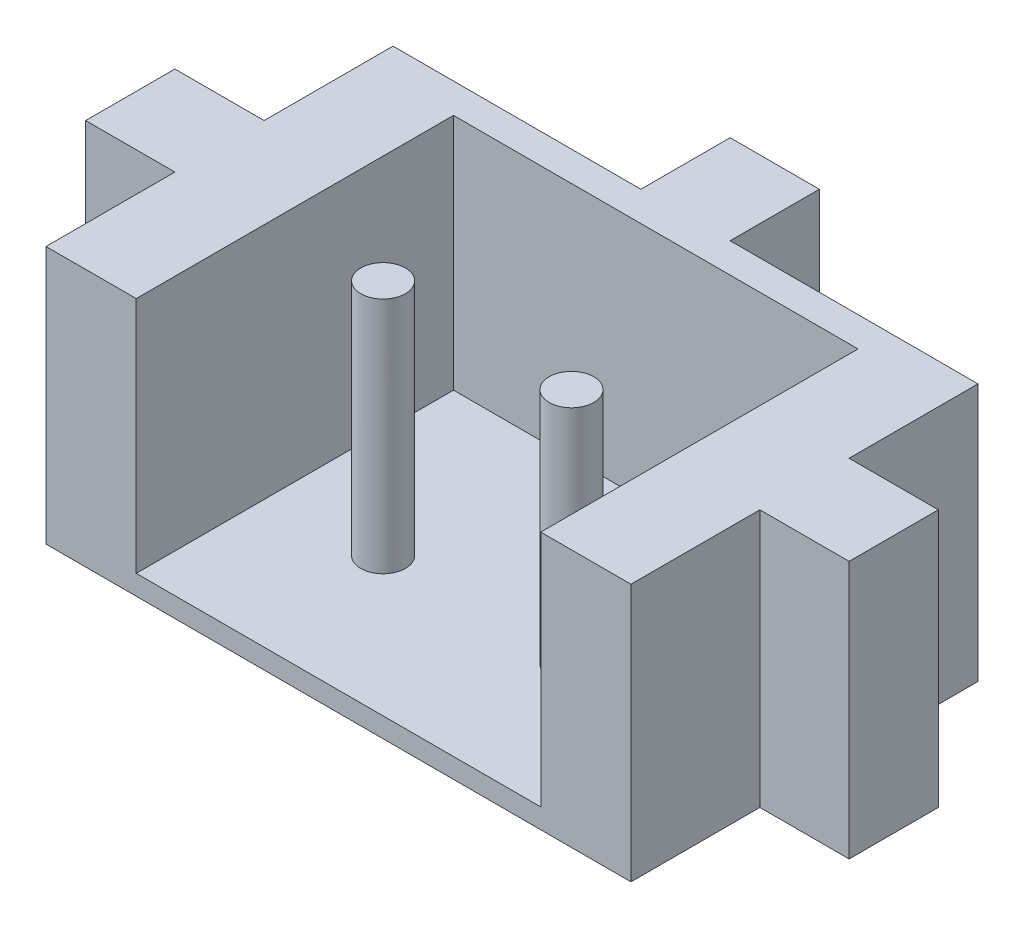
ISO-10303-21;
HEADER;
FILE_DESCRIPTION(('STEP AP214'),'2;1');
FILE_NAME('part.step','',(''),(''),'','','');
FILE_SCHEMA(('AUTOMOTIVE_DESIGN { 1 0 10303 214 1 1 1 1 }'));
ENDSEC;
DATA;
#1=APPLICATION_CONTEXT('core data for automotive mechanical design processes');
#2=APPLICATION_PROTOCOL_DEFINITION('international standard','automotive_design',2000,#1);
#3=PRODUCT_CONTEXT('',#1,'mechanical');
#4=PRODUCT('Part','Part','',(#3));
#5=PRODUCT_RELATED_PRODUCT_CATEGORY('part','',(#4));
#6=PRODUCT_DEFINITION_FORMATION('','',#4);
#7=PRODUCT_DEFINITION_CONTEXT('part definition',#1,'design');
#8=PRODUCT_DEFINITION('design','',#6,#7);
#9=PRODUCT_DEFINITION_SHAPE('','',#8);
#10=(LENGTH_UNIT() NAMED_UNIT(*) SI_UNIT(.MILLI.,.METRE.));
#11=(NAMED_UNIT(*) PLANE_ANGLE_UNIT() SI_UNIT($,.RADIAN.));
#12=(NAMED_UNIT(*) SI_UNIT($,.STERADIAN.) SOLID_ANGLE_UNIT());
#13=UNCERTAINTY_MEASURE_WITH_UNIT(LENGTH_MEASURE(1.E-05),#10,'distance_accuracy_value','');
#14=(GEOMETRIC_REPRESENTATION_CONTEXT(3) GLOBAL_UNCERTAINTY_ASSIGNED_CONTEXT((#13)) GLOBAL_UNIT_ASSIGNED_CONTEXT((#10,
#11,#12)) REPRESENTATION_CONTEXT('',''));
#15=CARTESIAN_POINT('',(0.,0.,0.));
#16=DIRECTION('',(0.,0.,1.));
#17=DIRECTION('',(1.,0.,0.));
#18=AXIS2_PLACEMENT_3D('',#15,#16,#17);
#19=CARTESIAN_POINT('',(-14.75,13.,-2.25));
#20=DIRECTION('',(1.,0.,0.));
#21=DIRECTION('',(0.,0.,-1.));
#22=AXIS2_PLACEMENT_3D('',#19,#20,#21);
#23=PLANE('',#22);
#24=DIRECTION('',(0.,0.,1.));
#25=VECTOR('',#24,1.);
#26=CARTESIAN_POINT('',(-14.75,0.,-2.25));
#27=LINE('',#26,#25);
#28=CARTESIAN_POINT('',(-14.75,0.,-8.75));
#29=VERTEX_POINT('',#28);
#30=CARTESIAN_POINT('',(-14.75,0.,-2.25));
#31=VERTEX_POINT('',#30);
#32=EDGE_CURVE('E202',#29,#31,#27,.T.);
#33=ORIENTED_EDGE('',*,*,#32,.T.);
#34=DIRECTION('',(0.,-1.,0.));
#35=VECTOR('',#34,1.);
#36=CARTESIAN_POINT('',(-14.75,13.,-2.25));
#37=LINE('',#36,#35);
#38=CARTESIAN_POINT('',(-14.75,13.,-2.25));
#39=VERTEX_POINT('',#38);
#40=EDGE_CURVE('E12',#39,#31,#37,.T.);
#41=ORIENTED_EDGE('',*,*,#40,.F.);
#42=DIRECTION('',(0.,0.,1.));
#43=VECTOR('',#42,1.);
#44=CARTESIAN_POINT('',(-14.75,13.,-2.25));
#45=LINE('',#44,#43);
#46=CARTESIAN_POINT('',(-14.75,13.,-8.75));
#47=VERTEX_POINT('',#46);
#48=EDGE_CURVE('E234',#47,#39,#45,.T.);
#49=ORIENTED_EDGE('',*,*,#48,.F.);
#50=DIRECTION('',(0.,-1.,0.));
#51=VECTOR('',#50,1.);
#52=CARTESIAN_POINT('',(-14.75,13.,-8.75));
#53=LINE('',#52,#51);
#54=EDGE_CURVE('E198',#47,#29,#53,.T.);
#55=ORIENTED_EDGE('',*,*,#54,.T.);
#56=EDGE_LOOP('',(#33,#41,#49,#55));
#57=FACE_BOUND('',#56,.T.);
#58=ADVANCED_FACE('F45',(#57),#23,.F.);
#59=CARTESIAN_POINT('',(-19.25,13.,-2.25));
#60=DIRECTION('',(0.,0.,1.));
#61=DIRECTION('',(1.,0.,0.));
#62=AXIS2_PLACEMENT_3D('',#59,#60,#61);
#63=PLANE('',#62);
#64=DIRECTION('',(-1.,0.,0.));
#65=VECTOR('',#64,1.);
#66=CARTESIAN_POINT('',(-19.25,0.,-2.25));
#67=LINE('',#66,#65);
#68=CARTESIAN_POINT('',(-19.25,0.,-2.25));
#69=VERTEX_POINT('',#68);
#70=EDGE_CURVE('E205',#31,#69,#67,.T.);
#71=ORIENTED_EDGE('',*,*,#70,.T.);
#72=DIRECTION('',(0.,-1.,0.));
#73=VECTOR('',#72,1.);
#74=CARTESIAN_POINT('',(-19.25,13.,-2.25));
#75=LINE('',#74,#73);
#76=CARTESIAN_POINT('',(-19.25,13.,-2.25));
#77=VERTEX_POINT('',#76);
#78=EDGE_CURVE('E52',#77,#69,#75,.T.);
#79=ORIENTED_EDGE('',*,*,#78,.F.);
#80=DIRECTION('',(-1.,0.,0.));
#81=VECTOR('',#80,1.);
#82=CARTESIAN_POINT('',(-19.25,13.,-2.25));
#83=LINE('',#82,#81);
#84=EDGE_CURVE('E133',#39,#77,#83,.T.);
#85=ORIENTED_EDGE('',*,*,#84,.F.);
#86=ORIENTED_EDGE('',*,*,#40,.T.);
#87=EDGE_LOOP('',(#71,#79,#85,#86));
#88=FACE_BOUND('',#87,.T.);
#89=ADVANCED_FACE('F393',(#88),#63,.F.);
#90=CARTESIAN_POINT('',(-19.25,13.,-2.25));
#91=DIRECTION('',(1.,0.,0.));
#92=DIRECTION('',(0.,0.,-1.));
#93=AXIS2_PLACEMENT_3D('',#90,#91,#92);
#94=PLANE('',#93);
#95=DIRECTION('',(0.,0.,1.));
#96=VECTOR('',#95,1.);
#97=CARTESIAN_POINT('',(-19.25,0.,-2.25));
#98=LINE('',#97,#96);
#99=CARTESIAN_POINT('',(-19.25,0.,2.25));
#100=VERTEX_POINT('',#99);
#101=EDGE_CURVE('E208',#69,#100,#98,.T.);
#102=ORIENTED_EDGE('',*,*,#101,.T.);
#103=DIRECTION('',(0.,-1.,0.));
#104=VECTOR('',#103,1.);
#105=CARTESIAN_POINT('',(-19.25,13.,2.25));
#106=LINE('',#105,#104);
#107=CARTESIAN_POINT('',(-19.25,13.,2.25));
#108=VERTEX_POINT('',#107);
#109=EDGE_CURVE('E265',#108,#100,#106,.T.);
#110=ORIENTED_EDGE('',*,*,#109,.F.);
#111=DIRECTION('',(0.,0.,1.));
#112=VECTOR('',#111,1.);
#113=CARTESIAN_POINT('',(-19.25,13.,-2.25));
#114=LINE('',#113,#112);
#115=EDGE_CURVE('E273',#77,#108,#114,.T.);
#116=ORIENTED_EDGE('',*,*,#115,.F.);
#117=ORIENTED_EDGE('',*,*,#78,.T.);
#118=EDGE_LOOP('',(#102,#110,#116,#117));
#119=FACE_BOUND('',#118,.T.);
#120=ADVANCED_FACE('F271',(#119),#94,.F.);
#121=CARTESIAN_POINT('',(-19.25,13.,2.25));
#122=DIRECTION('',(0.,0.,-1.));
#123=DIRECTION('',(-1.,0.,0.));
#124=AXIS2_PLACEMENT_3D('',#121,#122,#123);
#125=PLANE('',#124);
#126=DIRECTION('',(1.,0.,0.));
#127=VECTOR('',#126,1.);
#128=CARTESIAN_POINT('',(-19.25,0.,2.25));
#129=LINE('',#128,#127);
#130=CARTESIAN_POINT('',(-14.75,0.,2.25));
#131=VERTEX_POINT('',#130);
#132=EDGE_CURVE('E210',#100,#131,#129,.T.);
#133=ORIENTED_EDGE('',*,*,#132,.T.);
#134=DIRECTION('',(0.,-1.,0.));
#135=VECTOR('',#134,1.);
#136=CARTESIAN_POINT('',(-14.75,13.,2.25));
#137=LINE('',#136,#135);
#138=CARTESIAN_POINT('',(-14.75,13.,2.25));
#139=VERTEX_POINT('',#138);
#140=EDGE_CURVE('E262',#139,#131,#137,.T.);
#141=ORIENTED_EDGE('',*,*,#140,.F.);
#142=DIRECTION('',(1.,0.,0.));
#143=VECTOR('',#142,1.);
#144=CARTESIAN_POINT('',(-19.25,13.,2.25));
#145=LINE('',#144,#143);
#146=EDGE_CURVE('E292',#108,#139,#145,.T.);
#147=ORIENTED_EDGE('',*,*,#146,.F.);
#148=ORIENTED_EDGE('',*,*,#109,.T.);
#149=EDGE_LOOP('',(#133,#141,#147,#148));
#150=FACE_BOUND('',#149,.T.);
#151=ADVANCED_FACE('F282',(#150),#125,.F.);
#152=CARTESIAN_POINT('',(-14.75,13.,8.75));
#153=DIRECTION('',(1.,0.,0.));
#154=DIRECTION('',(0.,0.,-1.));
#155=AXIS2_PLACEMENT_3D('',#152,#153,#154);
#156=PLANE('',#155);
#157=DIRECTION('',(0.,0.,1.));
#158=VECTOR('',#157,1.);
#159=CARTESIAN_POINT('',(-14.75,0.,8.75));
#160=LINE('',#159,#158);
#161=CARTESIAN_POINT('',(-14.75,0.,8.75));
#162=VERTEX_POINT('',#161);
#163=EDGE_CURVE('E212',#131,#162,#160,.T.);
#164=ORIENTED_EDGE('',*,*,#163,.T.);
#165=DIRECTION('',(0.,-1.,0.));
#166=VECTOR('',#165,1.);
#167=CARTESIAN_POINT('',(-14.75,13.,8.75));
#168=LINE('',#167,#166);
#169=CARTESIAN_POINT('',(-14.75,13.,8.75));
#170=VERTEX_POINT('',#169);
#171=EDGE_CURVE('E259',#170,#162,#168,.T.);
#172=ORIENTED_EDGE('',*,*,#171,.F.);
#173=DIRECTION('',(0.,0.,1.));
#174=VECTOR('',#173,1.);
#175=CARTESIAN_POINT('',(-14.75,13.,8.75));
#176=LINE('',#175,#174);
#177=EDGE_CURVE('E288',#139,#170,#176,.T.);
#178=ORIENTED_EDGE('',*,*,#177,.F.);
#179=ORIENTED_EDGE('',*,*,#140,.T.);
#180=EDGE_LOOP('',(#164,#172,#178,#179));
#181=FACE_BOUND('',#180,.T.);
#182=ADVANCED_FACE('F286',(#181),#156,.F.);
#183=CARTESIAN_POINT('',(14.75,13.,8.75));
#184=DIRECTION('',(0.,0.,-1.));
#185=DIRECTION('',(-1.,0.,0.));
#186=AXIS2_PLACEMENT_3D('',#183,#184,#185);
#187=PLANE('',#186);
#188=DIRECTION('',(-1.,0.,0.));
#189=VECTOR('',#188,1.);
#190=CARTESIAN_POINT('',(-10.2,1.,8.75));
#191=LINE('',#190,#189);
#192=CARTESIAN_POINT('',(10.2,1.,8.74999999999999));
#193=VERTEX_POINT('',#192);
#194=CARTESIAN_POINT('',(-10.2,1.,8.75));
#195=VERTEX_POINT('',#194);
#196=EDGE_CURVE('E358',#193,#195,#191,.T.);
#197=ORIENTED_EDGE('',*,*,#196,.T.);
#198=DIRECTION('',(0.,1.,0.));
#199=VECTOR('',#198,1.);
#200=CARTESIAN_POINT('',(-10.2,-25.9260486769581,8.75));
#201=LINE('',#200,#199);
#202=CARTESIAN_POINT('',(-10.2,13.,8.75));
#203=VERTEX_POINT('',#202);
#204=EDGE_CURVE('E338',#195,#203,#201,.T.);
#205=ORIENTED_EDGE('',*,*,#204,.T.);
#206=DIRECTION('',(1.,0.,0.));
#207=VECTOR('',#206,1.);
#208=CARTESIAN_POINT('',(14.75,13.,8.75));
#209=LINE('',#208,#207);
#210=EDGE_CURVE('E294',#170,#203,#209,.T.);
#211=ORIENTED_EDGE('',*,*,#210,.F.);
#212=ORIENTED_EDGE('',*,*,#171,.T.);
#213=DIRECTION('',(1.,0.,0.));
#214=VECTOR('',#213,1.);
#215=CARTESIAN_POINT('',(14.75,0.,8.75));
#216=LINE('',#215,#214);
#217=CARTESIAN_POINT('',(14.75,0.,8.75));
#218=VERTEX_POINT('',#217);
#219=EDGE_CURVE('E214',#162,#218,#216,.T.);
#220=ORIENTED_EDGE('',*,*,#219,.T.);
#221=DIRECTION('',(0.,-1.,0.));
#222=VECTOR('',#221,1.);
#223=CARTESIAN_POINT('',(14.75,13.,8.75));
#224=LINE('',#223,#222);
#225=CARTESIAN_POINT('',(14.75,13.,8.75));
#226=VERTEX_POINT('',#225);
#227=EDGE_CURVE('E256',#226,#218,#224,.T.);
#228=ORIENTED_EDGE('',*,*,#227,.F.);
#229=CARTESIAN_POINT('',(10.2,13.,8.75));
#230=VERTEX_POINT('',#229);
#231=EDGE_CURVE('E291',#230,#226,#209,.T.);
#232=ORIENTED_EDGE('',*,*,#231,.F.);
#233=DIRECTION('',(0.,1.,0.));
#234=VECTOR('',#233,1.);
#235=CARTESIAN_POINT('',(10.2,-25.9260486769581,8.74999999999999));
#236=LINE('',#235,#234);
#237=EDGE_CURVE('E59',#193,#230,#236,.T.);
#238=ORIENTED_EDGE('',*,*,#237,.F.);
#239=EDGE_LOOP('',(#197,#205,#211,#212,#220,#228,#232,#238));
#240=FACE_BOUND('',#239,.T.);
#241=ADVANCED_FACE('F406',(#240),#187,.F.);
#242=CARTESIAN_POINT('',(14.75,13.,8.75));
#243=DIRECTION('',(-1.,0.,0.));
#244=DIRECTION('',(0.,0.,1.));
#245=AXIS2_PLACEMENT_3D('',#242,#243,#244);
#246=PLANE('',#245);
#247=DIRECTION('',(0.,0.,-1.));
#248=VECTOR('',#247,1.);
#249=CARTESIAN_POINT('',(14.75,0.,8.75));
#250=LINE('',#249,#248);
#251=CARTESIAN_POINT('',(14.75,0.,2.24999999999999));
#252=VERTEX_POINT('',#251);
#253=EDGE_CURVE('E216',#218,#252,#250,.T.);
#254=ORIENTED_EDGE('',*,*,#253,.T.);
#255=DIRECTION('',(0.,-1.,0.));
#256=VECTOR('',#255,1.);
#257=CARTESIAN_POINT('',(14.75,13.,2.24999999999999));
#258=LINE('',#257,#256);
#259=CARTESIAN_POINT('',(14.75,13.,2.24999999999999));
#260=VERTEX_POINT('',#259);
#261=EDGE_CURVE('E253',#260,#252,#258,.T.);
#262=ORIENTED_EDGE('',*,*,#261,.F.);
#263=DIRECTION('',(0.,0.,-1.));
#264=VECTOR('',#263,1.);
#265=CARTESIAN_POINT('',(14.75,13.,8.75));
#266=LINE('',#265,#264);
#267=EDGE_CURVE('E299',#226,#260,#266,.T.);
#268=ORIENTED_EDGE('',*,*,#267,.F.);
#269=ORIENTED_EDGE('',*,*,#227,.T.);
#270=EDGE_LOOP('',(#254,#262,#268,#269));
#271=FACE_BOUND('',#270,.T.);
#272=ADVANCED_FACE('F409',(#271),#246,.F.);
#273=CARTESIAN_POINT('',(19.25,13.,2.24999999999999));
#274=DIRECTION('',(0.,0.,-1.));
#275=DIRECTION('',(-1.,0.,0.));
#276=AXIS2_PLACEMENT_3D('',#273,#274,#275);
#277=PLANE('',#276);
#278=DIRECTION('',(1.,0.,0.));
#279=VECTOR('',#278,1.);
#280=CARTESIAN_POINT('',(19.25,0.,2.24999999999999));
#281=LINE('',#280,#279);
#282=CARTESIAN_POINT('',(19.25,0.,2.24999999999999));
#283=VERTEX_POINT('',#282);
#284=EDGE_CURVE('E218',#252,#283,#281,.T.);
#285=ORIENTED_EDGE('',*,*,#284,.T.);
#286=DIRECTION('',(0.,-1.,0.));
#287=VECTOR('',#286,1.);
#288=CARTESIAN_POINT('',(19.25,13.,2.24999999999999));
#289=LINE('',#288,#287);
#290=CARTESIAN_POINT('',(19.25,13.,2.24999999999999));
#291=VERTEX_POINT('',#290);
#292=EDGE_CURVE('E250',#291,#283,#289,.T.);
#293=ORIENTED_EDGE('',*,*,#292,.F.);
#294=DIRECTION('',(1.,0.,0.));
#295=VECTOR('',#294,1.);
#296=CARTESIAN_POINT('',(19.25,13.,2.24999999999999));
#297=LINE('',#296,#295);
#298=EDGE_CURVE('E301',#260,#291,#297,.T.);
#299=ORIENTED_EDGE('',*,*,#298,.F.);
#300=ORIENTED_EDGE('',*,*,#261,.T.);
#301=EDGE_LOOP('',(#285,#293,#299,#300));
#302=FACE_BOUND('',#301,.T.);
#303=ADVANCED_FACE('F413',(#302),#277,.F.);
#304=CARTESIAN_POINT('',(19.25,13.,-2.25000000000001));
#305=DIRECTION('',(-1.,0.,0.));
#306=DIRECTION('',(0.,0.,1.));
#307=AXIS2_PLACEMENT_3D('',#304,#305,#306);
#308=PLANE('',#307);
#309=DIRECTION('',(0.,0.,-1.));
#310=VECTOR('',#309,1.);
#311=CARTESIAN_POINT('',(19.25,0.,-2.25000000000001));
#312=LINE('',#311,#310);
#313=CARTESIAN_POINT('',(19.25,0.,-2.25000000000001));
#314=VERTEX_POINT('',#313);
#315=EDGE_CURVE('E220',#283,#314,#312,.T.);
#316=ORIENTED_EDGE('',*,*,#315,.T.);
#317=DIRECTION('',(0.,-1.,0.));
#318=VECTOR('',#317,1.);
#319=CARTESIAN_POINT('',(19.25,13.,-2.25000000000001));
#320=LINE('',#319,#318);
#321=CARTESIAN_POINT('',(19.25,13.,-2.25000000000001));
#322=VERTEX_POINT('',#321);
#323=EDGE_CURVE('E247',#322,#314,#320,.T.);
#324=ORIENTED_EDGE('',*,*,#323,.F.);
#325=DIRECTION('',(0.,0.,-1.));
#326=VECTOR('',#325,1.);
#327=CARTESIAN_POINT('',(19.25,13.,-2.25000000000001));
#328=LINE('',#327,#326);
#329=EDGE_CURVE('E303',#291,#322,#328,.T.);
#330=ORIENTED_EDGE('',*,*,#329,.F.);
#331=ORIENTED_EDGE('',*,*,#292,.T.);
#332=EDGE_LOOP('',(#316,#324,#330,#331));
#333=FACE_BOUND('',#332,.T.);
#334=ADVANCED_FACE('F417',(#333),#308,.F.);
#335=CARTESIAN_POINT('',(19.25,13.,-2.25000000000001));
#336=DIRECTION('',(0.,0.,1.));
#337=DIRECTION('',(1.,0.,0.));
#338=AXIS2_PLACEMENT_3D('',#335,#336,#337);
#339=PLANE('',#338);
#340=DIRECTION('',(-1.,0.,0.));
#341=VECTOR('',#340,1.);
#342=CARTESIAN_POINT('',(19.25,0.,-2.25000000000001));
#343=LINE('',#342,#341);
#344=CARTESIAN_POINT('',(14.75,0.,-2.25000000000001));
#345=VERTEX_POINT('',#344);
#346=EDGE_CURVE('E222',#314,#345,#343,.T.);
#347=ORIENTED_EDGE('',*,*,#346,.T.);
#348=DIRECTION('',(0.,-1.,0.));
#349=VECTOR('',#348,1.);
#350=CARTESIAN_POINT('',(14.75,13.,-2.25000000000001));
#351=LINE('',#350,#349);
#352=CARTESIAN_POINT('',(14.75,13.,-2.25000000000001));
#353=VERTEX_POINT('',#352);
#354=EDGE_CURVE('E244',#353,#345,#351,.T.);
#355=ORIENTED_EDGE('',*,*,#354,.F.);
#356=DIRECTION('',(-1.,0.,0.));
#357=VECTOR('',#356,1.);
#358=CARTESIAN_POINT('',(19.25,13.,-2.25000000000001));
#359=LINE('',#358,#357);
#360=EDGE_CURVE('E305',#322,#353,#359,.T.);
#361=ORIENTED_EDGE('',*,*,#360,.F.);
#362=ORIENTED_EDGE('',*,*,#323,.T.);
#363=EDGE_LOOP('',(#347,#355,#361,#362));
#364=FACE_BOUND('',#363,.T.);
#365=ADVANCED_FACE('F421',(#364),#339,.F.);
#366=CARTESIAN_POINT('',(14.75,13.,-2.25000000000001));
#367=DIRECTION('',(-1.,0.,0.));
#368=DIRECTION('',(0.,0.,1.));
#369=AXIS2_PLACEMENT_3D('',#366,#367,#368);
#370=PLANE('',#369);
#371=DIRECTION('',(0.,0.,-1.));
#372=VECTOR('',#371,1.);
#373=CARTESIAN_POINT('',(14.75,0.,-2.25000000000001));
#374=LINE('',#373,#372);
#375=CARTESIAN_POINT('',(14.75,0.,-8.75));
#376=VERTEX_POINT('',#375);
#377=EDGE_CURVE('E224',#345,#376,#374,.T.);
#378=ORIENTED_EDGE('',*,*,#377,.T.);
#379=DIRECTION('',(0.,-1.,0.));
#380=VECTOR('',#379,1.);
#381=CARTESIAN_POINT('',(14.75,13.,-8.75));
#382=LINE('',#381,#380);
#383=CARTESIAN_POINT('',(14.75,13.,-8.75));
#384=VERTEX_POINT('',#383);
#385=EDGE_CURVE('E241',#384,#376,#382,.T.);
#386=ORIENTED_EDGE('',*,*,#385,.F.);
#387=DIRECTION('',(0.,0.,-1.));
#388=VECTOR('',#387,1.);
#389=CARTESIAN_POINT('',(14.75,13.,-2.25000000000001));
#390=LINE('',#389,#388);
#391=EDGE_CURVE('E307',#353,#384,#390,.T.);
#392=ORIENTED_EDGE('',*,*,#391,.F.);
#393=ORIENTED_EDGE('',*,*,#354,.T.);
#394=EDGE_LOOP('',(#378,#386,#392,#393));
#395=FACE_BOUND('',#394,.T.);
#396=ADVANCED_FACE('F425',(#395),#370,.F.);
#397=CARTESIAN_POINT('',(14.75,13.,-8.75));
#398=DIRECTION('',(0.,0.,1.));
#399=DIRECTION('',(1.,0.,0.));
#400=AXIS2_PLACEMENT_3D('',#397,#398,#399);
#401=PLANE('',#400);
#402=DIRECTION('',(-1.,0.,0.));
#403=VECTOR('',#402,1.);
#404=CARTESIAN_POINT('',(14.75,0.,-8.75));
#405=LINE('',#404,#403);
#406=CARTESIAN_POINT('',(2.25,0.,-8.75));
#407=VERTEX_POINT('',#406);
#408=EDGE_CURVE('E226',#376,#407,#405,.T.);
#409=ORIENTED_EDGE('',*,*,#408,.T.);
#410=DIRECTION('',(0.,-1.,0.));
#411=VECTOR('',#410,1.);
#412=CARTESIAN_POINT('',(2.25,13.,-8.75));
#413=LINE('',#412,#411);
#414=CARTESIAN_POINT('',(2.25,13.,-8.75));
#415=VERTEX_POINT('',#414);
#416=EDGE_CURVE('E238',#415,#407,#413,.T.);
#417=ORIENTED_EDGE('',*,*,#416,.F.);
#418=DIRECTION('',(-1.,0.,0.));
#419=VECTOR('',#418,1.);
#420=CARTESIAN_POINT('',(14.75,13.,-8.75));
#421=LINE('',#420,#419);
#422=EDGE_CURVE('E309',#384,#415,#421,.T.);
#423=ORIENTED_EDGE('',*,*,#422,.F.);
#424=ORIENTED_EDGE('',*,*,#385,.T.);
#425=EDGE_LOOP('',(#409,#417,#423,#424));
#426=FACE_BOUND('',#425,.T.);
#427=ADVANCED_FACE('F315',(#426),#401,.F.);
#428=CARTESIAN_POINT('',(2.25,13.,-13.25));
#429=DIRECTION('',(-1.,0.,0.));
#430=DIRECTION('',(0.,0.,1.));
#431=AXIS2_PLACEMENT_3D('',#428,#429,#430);
#432=PLANE('',#431);
#433=DIRECTION('',(0.,0.,-1.));
#434=VECTOR('',#433,1.);
#435=CARTESIAN_POINT('',(2.25,0.,-13.25));
#436=LINE('',#435,#434);
#437=CARTESIAN_POINT('',(2.25,0.,-13.25));
#438=VERTEX_POINT('',#437);
#439=EDGE_CURVE('E228',#407,#438,#436,.T.);
#440=ORIENTED_EDGE('',*,*,#439,.T.);
#441=DIRECTION('',(0.,-1.,0.));
#442=VECTOR('',#441,1.);
#443=CARTESIAN_POINT('',(2.25,13.,-13.25));
#444=LINE('',#443,#442);
#445=CARTESIAN_POINT('',(2.25,13.,-13.25));
#446=VERTEX_POINT('',#445);
#447=EDGE_CURVE('E193',#446,#438,#444,.T.);
#448=ORIENTED_EDGE('',*,*,#447,.F.);
#449=DIRECTION('',(0.,0.,-1.));
#450=VECTOR('',#449,1.);
#451=CARTESIAN_POINT('',(2.25,13.,-13.25));
#452=LINE('',#451,#450);
#453=EDGE_CURVE('E181',#415,#446,#452,.T.);
#454=ORIENTED_EDGE('',*,*,#453,.F.);
#455=ORIENTED_EDGE('',*,*,#416,.T.);
#456=EDGE_LOOP('',(#440,#448,#454,#455));
#457=FACE_BOUND('',#456,.T.);
#458=ADVANCED_FACE('F319',(#457),#432,.F.);
#459=CARTESIAN_POINT('',(2.25,13.,-13.25));
#460=DIRECTION('',(0.,0.,1.));
#461=DIRECTION('',(1.,0.,0.));
#462=AXIS2_PLACEMENT_3D('',#459,#460,#461);
#463=PLANE('',#462);
#464=DIRECTION('',(-1.,0.,0.));
#465=VECTOR('',#464,1.);
#466=CARTESIAN_POINT('',(2.25,0.,-13.25));
#467=LINE('',#466,#465);
#468=CARTESIAN_POINT('',(-2.25,0.,-13.25));
#469=VERTEX_POINT('',#468);
#470=EDGE_CURVE('E190',#438,#469,#467,.T.);
#471=ORIENTED_EDGE('',*,*,#470,.T.);
#472=DIRECTION('',(0.,-1.,0.));
#473=VECTOR('',#472,1.);
#474=CARTESIAN_POINT('',(-2.25,13.,-13.25));
#475=LINE('',#474,#473);
#476=CARTESIAN_POINT('',(-2.25,13.,-13.25));
#477=VERTEX_POINT('',#476);
#478=EDGE_CURVE('E187',#477,#469,#475,.T.);
#479=ORIENTED_EDGE('',*,*,#478,.F.);
#480=DIRECTION('',(-1.,0.,0.));
#481=VECTOR('',#480,1.);
#482=CARTESIAN_POINT('',(2.25,13.,-13.25));
#483=LINE('',#482,#481);
#484=EDGE_CURVE('E173',#446,#477,#483,.T.);
#485=ORIENTED_EDGE('',*,*,#484,.F.);
#486=ORIENTED_EDGE('',*,*,#447,.T.);
#487=EDGE_LOOP('',(#471,#479,#485,#486));
#488=FACE_BOUND('',#487,.T.);
#489=ADVANCED_FACE('F188',(#488),#463,.F.);
#490=CARTESIAN_POINT('',(-2.25,13.,-13.25));
#491=DIRECTION('',(1.,0.,0.));
#492=DIRECTION('',(0.,0.,-1.));
#493=AXIS2_PLACEMENT_3D('',#490,#491,#492);
#494=PLANE('',#493);
#495=DIRECTION('',(0.,0.,1.));
#496=VECTOR('',#495,1.);
#497=CARTESIAN_POINT('',(-2.25,0.,-13.25));
#498=LINE('',#497,#496);
#499=CARTESIAN_POINT('',(-2.25,0.,-8.75));
#500=VERTEX_POINT('',#499);
#501=EDGE_CURVE('E231',#469,#500,#498,.T.);
#502=ORIENTED_EDGE('',*,*,#501,.T.);
#503=DIRECTION('',(0.,-1.,0.));
#504=VECTOR('',#503,1.);
#505=CARTESIAN_POINT('',(-2.25,13.,-8.75));
#506=LINE('',#505,#504);
#507=CARTESIAN_POINT('',(-2.25,13.,-8.75));
#508=VERTEX_POINT('',#507);
#509=EDGE_CURVE('E194',#508,#500,#506,.T.);
#510=ORIENTED_EDGE('',*,*,#509,.F.);
#511=DIRECTION('',(0.,0.,1.));
#512=VECTOR('',#511,1.);
#513=CARTESIAN_POINT('',(-2.25,13.,-13.25));
#514=LINE('',#513,#512);
#515=EDGE_CURVE('E178',#477,#508,#514,.T.);
#516=ORIENTED_EDGE('',*,*,#515,.F.);
#517=ORIENTED_EDGE('',*,*,#478,.T.);
#518=EDGE_LOOP('',(#502,#510,#516,#517));
#519=FACE_BOUND('',#518,.T.);
#520=ADVANCED_FACE('F196',(#519),#494,.F.);
#521=CARTESIAN_POINT('',(-2.25,13.,-8.75));
#522=DIRECTION('',(0.,0.,1.));
#523=DIRECTION('',(1.,0.,0.));
#524=AXIS2_PLACEMENT_3D('',#521,#522,#523);
#525=PLANE('',#524);
#526=DIRECTION('',(-1.,0.,0.));
#527=VECTOR('',#526,1.);
#528=CARTESIAN_POINT('',(-2.25,0.,-8.75));
#529=LINE('',#528,#527);
#530=EDGE_CURVE('E125',#500,#29,#529,.T.);
#531=ORIENTED_EDGE('',*,*,#530,.T.);
#532=ORIENTED_EDGE('',*,*,#54,.F.);
#533=DIRECTION('',(-1.,0.,0.));
#534=VECTOR('',#533,1.);
#535=CARTESIAN_POINT('',(-2.25,13.,-8.75));
#536=LINE('',#535,#534);
#537=EDGE_CURVE('E68',#508,#47,#536,.T.);
#538=ORIENTED_EDGE('',*,*,#537,.F.);
#539=ORIENTED_EDGE('',*,*,#509,.T.);
#540=EDGE_LOOP('',(#531,#532,#538,#539));
#541=FACE_BOUND('',#540,.T.);
#542=ADVANCED_FACE('F320',(#541),#525,.F.);
#543=CARTESIAN_POINT('',(0.,13.,0.));
#544=DIRECTION('',(0.,1.,0.));
#545=DIRECTION('',(0.,0.,1.));
#546=AXIS2_PLACEMENT_3D('',#543,#544,#545);
#547=PLANE('',#546);
#548=DIRECTION('',(0.,0.,1.));
#549=VECTOR('',#548,1.);
#550=CARTESIAN_POINT('',(-10.2,13.,-7.25));
#551=LINE('',#550,#549);
#552=CARTESIAN_POINT('',(-10.2,13.,-7.25));
#553=VERTEX_POINT('',#552);
#554=EDGE_CURVE('E335',#553,#203,#551,.T.);
#555=ORIENTED_EDGE('',*,*,#554,.F.);
#556=DIRECTION('',(-1.,0.,0.));
#557=VECTOR('',#556,1.);
#558=CARTESIAN_POINT('',(-10.2,13.,-7.25));
#559=LINE('',#558,#557);
#560=CARTESIAN_POINT('',(10.2,13.,-7.25));
#561=VERTEX_POINT('',#560);
#562=EDGE_CURVE('E345',#561,#553,#559,.T.);
#563=ORIENTED_EDGE('',*,*,#562,.F.);
#564=DIRECTION('',(0.,0.,-1.));
#565=VECTOR('',#564,1.);
#566=CARTESIAN_POINT('',(10.2,13.,-7.25));
#567=LINE('',#566,#565);
#568=EDGE_CURVE('E348',#230,#561,#567,.T.);
#569=ORIENTED_EDGE('',*,*,#568,.F.);
#570=ORIENTED_EDGE('',*,*,#231,.T.);
#571=ORIENTED_EDGE('',*,*,#267,.T.);
#572=ORIENTED_EDGE('',*,*,#298,.T.);
#573=ORIENTED_EDGE('',*,*,#329,.T.);
#574=ORIENTED_EDGE('',*,*,#360,.T.);
#575=ORIENTED_EDGE('',*,*,#391,.T.);
#576=ORIENTED_EDGE('',*,*,#422,.T.);
#577=ORIENTED_EDGE('',*,*,#453,.T.);
#578=ORIENTED_EDGE('',*,*,#484,.T.);
#579=ORIENTED_EDGE('',*,*,#515,.T.);
#580=ORIENTED_EDGE('',*,*,#537,.T.);
#581=ORIENTED_EDGE('',*,*,#48,.T.);
#582=ORIENTED_EDGE('',*,*,#84,.T.);
#583=ORIENTED_EDGE('',*,*,#115,.T.);
#584=ORIENTED_EDGE('',*,*,#146,.T.);
#585=ORIENTED_EDGE('',*,*,#177,.T.);
#586=ORIENTED_EDGE('',*,*,#210,.T.);
#587=EDGE_LOOP('',(#555,#563,#569,#570,#571,#572,#573,#574,#575,#576,#577,#578,#579,#580,#581,
#582,#583,#584,#585,#586));
#588=FACE_BOUND('',#587,.T.);
#589=ADVANCED_FACE('F176',(#588),#547,.T.);
#590=CARTESIAN_POINT('',(0.,0.,0.));
#591=DIRECTION('',(0.,1.,0.));
#592=DIRECTION('',(0.,0.,1.));
#593=AXIS2_PLACEMENT_3D('',#590,#591,#592);
#594=PLANE('',#593);
#595=ORIENTED_EDGE('',*,*,#32,.F.);
#596=ORIENTED_EDGE('',*,*,#530,.F.);
#597=ORIENTED_EDGE('',*,*,#501,.F.);
#598=ORIENTED_EDGE('',*,*,#470,.F.);
#599=ORIENTED_EDGE('',*,*,#439,.F.);
#600=ORIENTED_EDGE('',*,*,#408,.F.);
#601=ORIENTED_EDGE('',*,*,#377,.F.);
#602=ORIENTED_EDGE('',*,*,#346,.F.);
#603=ORIENTED_EDGE('',*,*,#315,.F.);
#604=ORIENTED_EDGE('',*,*,#284,.F.);
#605=ORIENTED_EDGE('',*,*,#253,.F.);
#606=ORIENTED_EDGE('',*,*,#219,.F.);
#607=ORIENTED_EDGE('',*,*,#163,.F.);
#608=ORIENTED_EDGE('',*,*,#132,.F.);
#609=ORIENTED_EDGE('',*,*,#101,.F.);
#610=ORIENTED_EDGE('',*,*,#70,.F.);
#611=EDGE_LOOP('',(#595,#596,#597,#598,#599,#600,#601,#602,#603,#604,#605,#606,#607,#608,#609,#610));
#612=FACE_BOUND('',#611,.T.);
#613=ADVANCED_FACE('F277',(#612),#594,.F.);
#614=CARTESIAN_POINT('',(-10.2,-25.9260486769581,-7.25));
#615=DIRECTION('',(0.,0.,-1.));
#616=DIRECTION('',(-1.,0.,0.));
#617=AXIS2_PLACEMENT_3D('',#614,#615,#616);
#618=PLANE('',#617);
#619=DIRECTION('',(1.,0.,0.));
#620=VECTOR('',#619,1.);
#621=CARTESIAN_POINT('',(-10.2,1.,-7.25));
#622=LINE('',#621,#620);
#623=CARTESIAN_POINT('',(-10.2,1.,-7.25));
#624=VERTEX_POINT('',#623);
#625=CARTESIAN_POINT('',(10.2,1.,-7.25));
#626=VERTEX_POINT('',#625);
#627=EDGE_CURVE('E330',#624,#626,#622,.T.);
#628=ORIENTED_EDGE('',*,*,#627,.T.);
#629=DIRECTION('',(0.,1.,0.));
#630=VECTOR('',#629,1.);
#631=CARTESIAN_POINT('',(10.2,-25.9260486769581,-7.25));
#632=LINE('',#631,#630);
#633=EDGE_CURVE('E331',#626,#561,#632,.T.);
#634=ORIENTED_EDGE('',*,*,#633,.T.);
#635=ORIENTED_EDGE('',*,*,#562,.T.);
#636=DIRECTION('',(0.,1.,0.));
#637=VECTOR('',#636,1.);
#638=CARTESIAN_POINT('',(-10.2,-25.9260486769581,-7.25));
#639=LINE('',#638,#637);
#640=EDGE_CURVE('E334',#624,#553,#639,.T.);
#641=ORIENTED_EDGE('',*,*,#640,.F.);
#642=EDGE_LOOP('',(#628,#634,#635,#641));
#643=FACE_BOUND('',#642,.T.);
#644=ADVANCED_FACE('F440',(#643),#618,.F.);
#645=CARTESIAN_POINT('',(-10.2,-25.9260486769581,-7.25));
#646=DIRECTION('',(-1.,0.,0.));
#647=DIRECTION('',(0.,0.,1.));
#648=AXIS2_PLACEMENT_3D('',#645,#646,#647);
#649=PLANE('',#648);
#650=DIRECTION('',(0.,0.,-1.));
#651=VECTOR('',#650,1.);
#652=CARTESIAN_POINT('',(-10.2,1.,-7.25));
#653=LINE('',#652,#651);
#654=EDGE_CURVE('E342',#195,#624,#653,.T.);
#655=ORIENTED_EDGE('',*,*,#654,.T.);
#656=ORIENTED_EDGE('',*,*,#640,.T.);
#657=ORIENTED_EDGE('',*,*,#554,.T.);
#658=ORIENTED_EDGE('',*,*,#204,.F.);
#659=EDGE_LOOP('',(#655,#656,#657,#658));
#660=FACE_BOUND('',#659,.T.);
#661=ADVANCED_FACE('F444',(#660),#649,.F.);
#662=CARTESIAN_POINT('',(10.2,-25.9260486769581,-7.25));
#663=DIRECTION('',(1.,0.,0.));
#664=DIRECTION('',(0.,0.,-1.));
#665=AXIS2_PLACEMENT_3D('',#662,#663,#664);
#666=PLANE('',#665);
#667=DIRECTION('',(0.,0.,1.));
#668=VECTOR('',#667,1.);
#669=CARTESIAN_POINT('',(10.2,1.,-7.25));
#670=LINE('',#669,#668);
#671=EDGE_CURVE('E356',#626,#193,#670,.T.);
#672=ORIENTED_EDGE('',*,*,#671,.T.);
#673=ORIENTED_EDGE('',*,*,#237,.T.);
#674=ORIENTED_EDGE('',*,*,#568,.T.);
#675=ORIENTED_EDGE('',*,*,#633,.F.);
#676=EDGE_LOOP('',(#672,#673,#674,#675));
#677=FACE_BOUND('',#676,.T.);
#678=ADVANCED_FACE('F374',(#677),#666,.F.);
#679=CARTESIAN_POINT('',(4.75,-25.9260486769581,1.75));
#680=DIRECTION('',(0.,1.,0.));
#681=DIRECTION('',(0.,0.,1.));
#682=AXIS2_PLACEMENT_3D('',#679,#680,#681);
#683=CYLINDRICAL_SURFACE('',#682,1.125);
#684=CARTESIAN_POINT('',(4.75,1.,1.75));
#685=DIRECTION('',(0.,1.,0.));
#686=DIRECTION('',(0.,0.,1.));
#687=AXIS2_PLACEMENT_3D('',#684,#685,#686);
#688=CIRCLE('',#687,1.125);
#689=CARTESIAN_POINT('',(4.75,1.,2.875));
#690=VERTEX_POINT('',#689);
#691=EDGE_CURVE('E206',#690,#690,#688,.F.);
#692=ORIENTED_EDGE('',*,*,#691,.F.);
#693=EDGE_LOOP('',(#692));
#694=FACE_BOUND('',#693,.T.);
#695=CARTESIAN_POINT('',(4.75,13.,1.75));
#696=DIRECTION('',(0.,1.,0.));
#697=DIRECTION('',(0.,0.,1.));
#698=AXIS2_PLACEMENT_3D('',#695,#696,#697);
#699=CIRCLE('',#698,1.125);
#700=CARTESIAN_POINT('',(4.75,13.,2.875));
#701=VERTEX_POINT('',#700);
#702=EDGE_CURVE('E350',#701,#701,#699,.T.);
#703=ORIENTED_EDGE('',*,*,#702,.F.);
#704=EDGE_LOOP('',(#703));
#705=FACE_BOUND('',#704,.T.);
#706=ADVANCED_FACE('F370',(#694,#705),#683,.T.);
#707=CARTESIAN_POINT('',(-4.75,-25.9260486769581,1.75));
#708=DIRECTION('',(0.,1.,0.));
#709=DIRECTION('',(0.,0.,1.));
#710=AXIS2_PLACEMENT_3D('',#707,#708,#709);
#711=CYLINDRICAL_SURFACE('',#710,1.125);
#712=CARTESIAN_POINT('',(-4.75,1.,1.75));
#713=DIRECTION('',(0.,1.,0.));
#714=DIRECTION('',(0.,0.,1.));
#715=AXIS2_PLACEMENT_3D('',#712,#713,#714);
#716=CIRCLE('',#715,1.125);
#717=CARTESIAN_POINT('',(-4.75,1.,2.875));
#718=VERTEX_POINT('',#717);
#719=EDGE_CURVE('E327',#718,#718,#716,.F.);
#720=ORIENTED_EDGE('',*,*,#719,.F.);
#721=EDGE_LOOP('',(#720));
#722=FACE_BOUND('',#721,.T.);
#723=CARTESIAN_POINT('',(-4.75,13.,1.75));
#724=DIRECTION('',(0.,1.,0.));
#725=DIRECTION('',(0.,0.,-1.));
#726=AXIS2_PLACEMENT_3D('',#723,#724,#725);
#727=CIRCLE('',#726,1.125);
#728=CARTESIAN_POINT('',(-4.75,13.,0.625000000000003));
#729=VERTEX_POINT('',#728);
#730=EDGE_CURVE('E353',#729,#729,#727,.T.);
#731=ORIENTED_EDGE('',*,*,#730,.F.);
#732=EDGE_LOOP('',(#731));
#733=FACE_BOUND('',#732,.T.);
#734=ADVANCED_FACE('F373',(#722,#733),#711,.T.);
#735=CARTESIAN_POINT('',(0.,1.,0.));
#736=DIRECTION('',(0.,1.,0.));
#737=DIRECTION('',(0.,0.,1.));
#738=AXIS2_PLACEMENT_3D('',#735,#736,#737);
#739=PLANE('',#738);
#740=ORIENTED_EDGE('',*,*,#671,.F.);
#741=ORIENTED_EDGE('',*,*,#627,.F.);
#742=ORIENTED_EDGE('',*,*,#654,.F.);
#743=ORIENTED_EDGE('',*,*,#196,.F.);
#744=EDGE_LOOP('',(#740,#741,#742,#743));
#745=FACE_BOUND('',#744,.T.);
#746=ORIENTED_EDGE('',*,*,#719,.T.);
#747=EDGE_LOOP('',(#746));
#748=FACE_BOUND('',#747,.T.);
#749=ORIENTED_EDGE('',*,*,#691,.T.);
#750=EDGE_LOOP('',(#749));
#751=FACE_BOUND('',#750,.T.);
#752=ADVANCED_FACE('F368',(#745,#748,#751),#739,.T.);
#753=ORIENTED_EDGE('',*,*,#702,.T.);
#754=EDGE_LOOP('',(#753));
#755=FACE_BOUND('',#754,.T.);
#756=ADVANCED_FACE('F378',(#755),#547,.T.);
#757=ORIENTED_EDGE('',*,*,#730,.T.);
#758=EDGE_LOOP('',(#757));
#759=FACE_BOUND('',#758,.T.);
#760=ADVANCED_FACE('F380',(#759),#547,.T.);
#761=CLOSED_SHELL('',(#58,#89,#120,#151,#182,#241,#272,#303,#334,#365,#396,#427,#458,#489,#520,
#542,#589,#613,#644,#661,#678,#706,#734,#752,#756,#760));
#762=MANIFOLD_SOLID_BREP('B2',#761);
#763=ADVANCED_BREP_SHAPE_REPRESENTATION('',(#18,#762),#14);
#764=SHAPE_DEFINITION_REPRESENTATION(#9,#763);
ENDSEC;
END-ISO-10303-21;
